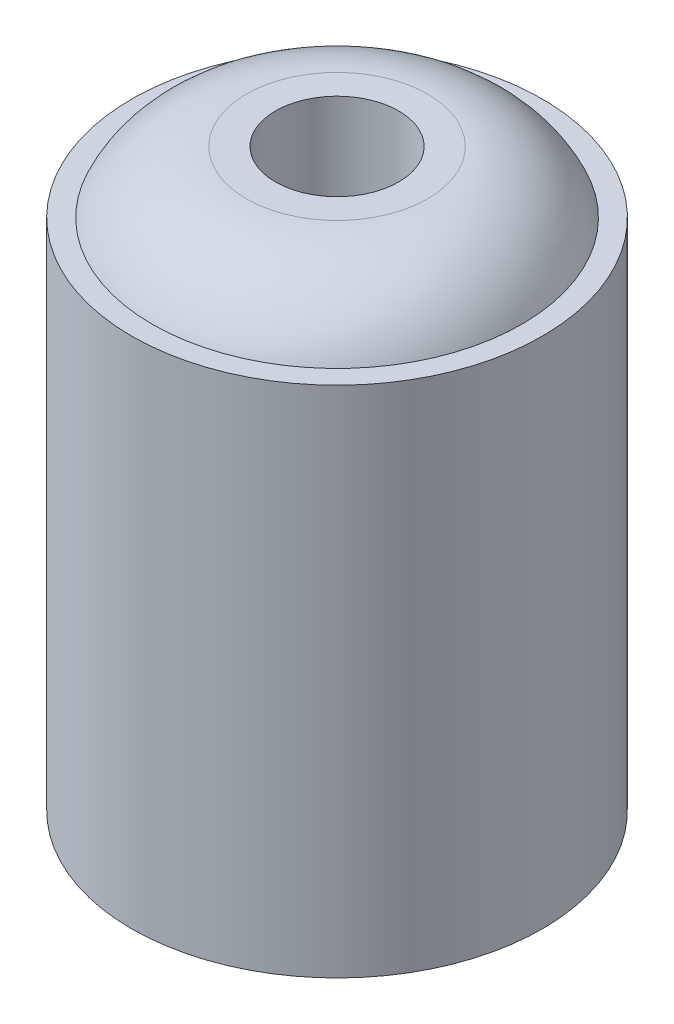
ISO-10303-21;
HEADER;
FILE_DESCRIPTION(('STEP AP214'),'2;1');
FILE_NAME('part.step','',(''),(''),'','','');
FILE_SCHEMA(('AUTOMOTIVE_DESIGN { 1 0 10303 214 1 1 1 1 }'));
ENDSEC;
DATA;
#1=APPLICATION_CONTEXT('core data for automotive mechanical design processes');
#2=APPLICATION_PROTOCOL_DEFINITION('international standard','automotive_design',2000,#1);
#3=PRODUCT_CONTEXT('',#1,'mechanical');
#4=PRODUCT('Part','Part','',(#3));
#5=PRODUCT_RELATED_PRODUCT_CATEGORY('part','',(#4));
#6=PRODUCT_DEFINITION_FORMATION('','',#4);
#7=PRODUCT_DEFINITION_CONTEXT('part definition',#1,'design');
#8=PRODUCT_DEFINITION('design','',#6,#7);
#9=PRODUCT_DEFINITION_SHAPE('','',#8);
#10=(LENGTH_UNIT() NAMED_UNIT(*) SI_UNIT(.MILLI.,.METRE.));
#11=(NAMED_UNIT(*) PLANE_ANGLE_UNIT() SI_UNIT($,.RADIAN.));
#12=(NAMED_UNIT(*) SI_UNIT($,.STERADIAN.) SOLID_ANGLE_UNIT());
#13=UNCERTAINTY_MEASURE_WITH_UNIT(LENGTH_MEASURE(1.E-05),#10,'distance_accuracy_value','');
#14=(GEOMETRIC_REPRESENTATION_CONTEXT(3) GLOBAL_UNCERTAINTY_ASSIGNED_CONTEXT((#13)) GLOBAL_UNIT_ASSIGNED_CONTEXT((#10,
#11,#12)) REPRESENTATION_CONTEXT('',''));
#15=CARTESIAN_POINT('',(0.,0.,0.));
#16=DIRECTION('',(0.,0.,1.));
#17=DIRECTION('',(1.,0.,0.));
#18=AXIS2_PLACEMENT_3D('',#15,#16,#17);
#19=CARTESIAN_POINT('',(0.,0.,0.));
#20=DIRECTION('',(0.,1.,0.));
#21=DIRECTION('',(0.,0.,1.));
#22=AXIS2_PLACEMENT_3D('',#19,#20,#21);
#23=PLANE('',#22);
#24=CARTESIAN_POINT('',(0.,0.,0.));
#25=DIRECTION('',(0.,1.,0.));
#26=DIRECTION('',(0.,0.,1.));
#27=AXIS2_PLACEMENT_3D('',#24,#25,#26);
#28=CIRCLE('',#27,10.);
#29=CARTESIAN_POINT('',(0.,0.,10.));
#30=VERTEX_POINT('',#29);
#31=EDGE_CURVE('E46',#30,#30,#28,.T.);
#32=ORIENTED_EDGE('',*,*,#31,.F.);
#33=EDGE_LOOP('',(#32));
#34=FACE_BOUND('',#33,.T.);
#35=CARTESIAN_POINT('',(0.,0.,0.));
#36=DIRECTION('',(0.,1.,0.));
#37=DIRECTION('',(0.,0.,1.));
#38=AXIS2_PLACEMENT_3D('',#35,#36,#37);
#39=CIRCLE('',#38,3.);
#40=CARTESIAN_POINT('',(0.,0.,3.));
#41=VERTEX_POINT('',#40);
#42=EDGE_CURVE('E57',#41,#41,#39,.T.);
#43=ORIENTED_EDGE('',*,*,#42,.T.);
#44=EDGE_LOOP('',(#43));
#45=FACE_BOUND('',#44,.T.);
#46=ADVANCED_FACE('F35',(#34,#45),#23,.F.);
#47=CARTESIAN_POINT('',(0.,28.,0.));
#48=DIRECTION('',(0.,1.,0.));
#49=DIRECTION('',(0.,0.,1.));
#50=AXIS2_PLACEMENT_3D('',#47,#48,#49);
#51=PLANE('',#50);
#52=CARTESIAN_POINT('',(0.,28.,0.));
#53=DIRECTION('',(0.,1.,0.));
#54=DIRECTION('',(0.,0.,1.));
#55=AXIS2_PLACEMENT_3D('',#52,#53,#54);
#56=CIRCLE('',#55,4.41742430504416);
#57=CARTESIAN_POINT('',(0.,28.,4.41742430504416));
#58=VERTEX_POINT('',#57);
#59=EDGE_CURVE('E10',#58,#58,#56,.T.);
#60=ORIENTED_EDGE('',*,*,#59,.T.);
#61=EDGE_LOOP('',(#60));
#62=FACE_BOUND('',#61,.T.);
#63=CARTESIAN_POINT('',(0.,28.,0.));
#64=DIRECTION('',(0.,1.,0.));
#65=DIRECTION('',(0.,0.,1.));
#66=AXIS2_PLACEMENT_3D('',#63,#64,#65);
#67=CIRCLE('',#66,3.);
#68=CARTESIAN_POINT('',(0.,28.,3.));
#69=VERTEX_POINT('',#68);
#70=EDGE_CURVE('E55',#69,#69,#67,.F.);
#71=ORIENTED_EDGE('',*,*,#70,.T.);
#72=EDGE_LOOP('',(#71));
#73=FACE_BOUND('',#72,.T.);
#74=ADVANCED_FACE('F79',(#62,#73),#51,.T.);
#75=CARTESIAN_POINT('',(0.,25.,0.));
#76=DIRECTION('',(0.,1.,0.));
#77=DIRECTION('',(0.,0.,1.));
#78=AXIS2_PLACEMENT_3D('',#75,#76,#77);
#79=PLANE('',#78);
#80=CARTESIAN_POINT('',(0.,25.,0.));
#81=DIRECTION('',(0.,1.,0.));
#82=DIRECTION('',(0.,0.,1.));
#83=AXIS2_PLACEMENT_3D('',#80,#81,#82);
#84=CIRCLE('',#83,10.);
#85=CARTESIAN_POINT('',(0.,25.,10.));
#86=VERTEX_POINT('',#85);
#87=EDGE_CURVE('E42',#86,#86,#84,.T.);
#88=ORIENTED_EDGE('',*,*,#87,.T.);
#89=EDGE_LOOP('',(#88));
#90=FACE_BOUND('',#89,.T.);
#91=CARTESIAN_POINT('',(0.,25.,0.));
#92=DIRECTION('',(0.,1.,0.));
#93=DIRECTION('',(0.,0.,1.));
#94=AXIS2_PLACEMENT_3D('',#91,#92,#93);
#95=CIRCLE('',#94,9.);
#96=CARTESIAN_POINT('',(0.,25.,9.));
#97=VERTEX_POINT('',#96);
#98=EDGE_CURVE('E51',#97,#97,#95,.F.);
#99=ORIENTED_EDGE('',*,*,#98,.T.);
#100=EDGE_LOOP('',(#99));
#101=FACE_BOUND('',#100,.T.);
#102=ADVANCED_FACE('F75',(#90,#101),#79,.T.);
#103=CARTESIAN_POINT('',(0.,25.,0.));
#104=DIRECTION('',(0.,-1.,0.));
#105=DIRECTION('',(0.,0.,-1.));
#106=AXIS2_PLACEMENT_3D('',#103,#104,#105);
#107=CYLINDRICAL_SURFACE('',#106,10.);
#108=ORIENTED_EDGE('',*,*,#87,.F.);
#109=EDGE_LOOP('',(#108));
#110=FACE_BOUND('',#109,.T.);
#111=ORIENTED_EDGE('',*,*,#31,.T.);
#112=EDGE_LOOP('',(#111));
#113=FACE_BOUND('',#112,.T.);
#114=ADVANCED_FACE('F67',(#110,#113),#107,.T.);
#115=CARTESIAN_POINT('',(0.,42.,0.));
#116=DIRECTION('',(0.,-1.,0.));
#117=DIRECTION('',(0.,0.,-1.));
#118=AXIS2_PLACEMENT_3D('',#115,#116,#117);
#119=CYLINDRICAL_SURFACE('',#118,3.);
#120=ORIENTED_EDGE('',*,*,#70,.F.);
#121=EDGE_LOOP('',(#120));
#122=FACE_BOUND('',#121,.T.);
#123=ORIENTED_EDGE('',*,*,#42,.F.);
#124=EDGE_LOOP('',(#123));
#125=FACE_BOUND('',#124,.T.);
#126=ADVANCED_FACE('F65',(#122,#125),#119,.F.);
#127=CARTESIAN_POINT('',(0.,23.,0.));
#128=DIRECTION('',(0.,-1.,0.));
#129=DIRECTION('',(0.,0.,-1.));
#130=AXIS2_PLACEMENT_3D('',#127,#128,#129);
#131=DEGENERATE_TOROIDAL_SURFACE('',#130,4.41742430504416,5.,.T.);
#132=ORIENTED_EDGE('',*,*,#98,.F.);
#133=EDGE_LOOP('',(#132));
#134=FACE_BOUND('',#133,.T.);
#135=ORIENTED_EDGE('',*,*,#59,.F.);
#136=EDGE_LOOP('',(#135));
#137=FACE_BOUND('',#136,.T.);
#138=ADVANCED_FACE('F37',(#134,#137),#131,.T.);
#139=CLOSED_SHELL('',(#46,#74,#102,#114,#126,#138));
#140=MANIFOLD_SOLID_BREP('B2',#139);
#141=ADVANCED_BREP_SHAPE_REPRESENTATION('',(#18,#140),#14);
#142=SHAPE_DEFINITION_REPRESENTATION(#9,#141);
ENDSEC;
END-ISO-10303-21;
